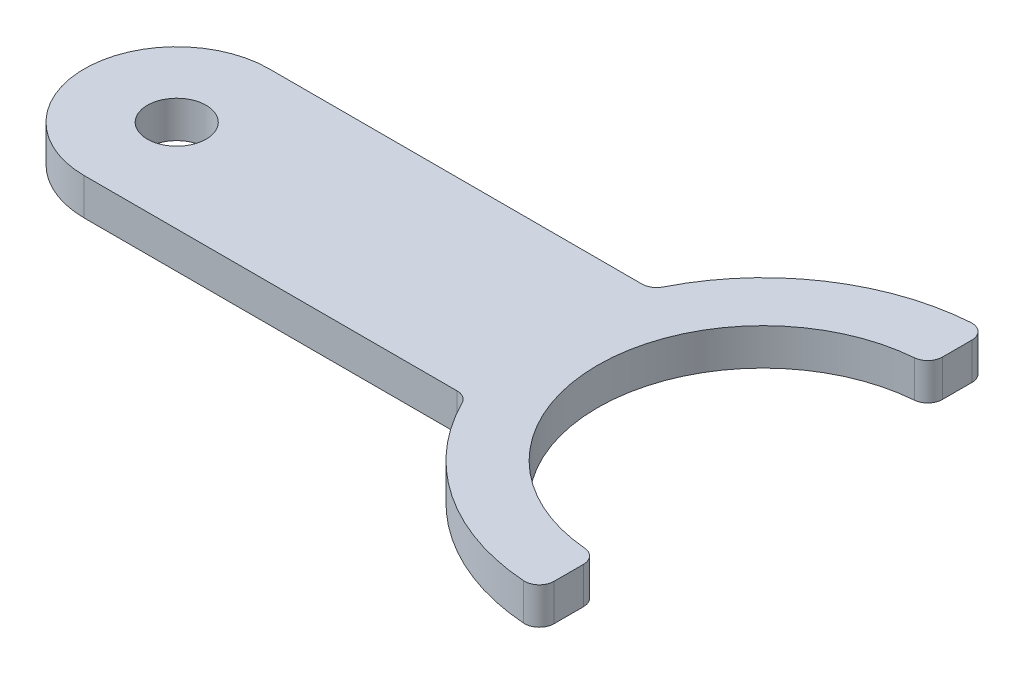
ISO-10303-21;
HEADER;
FILE_DESCRIPTION(('STEP AP214'),'2;1');
FILE_NAME('part.step','',(''),(''),'','','');
FILE_SCHEMA(('AUTOMOTIVE_DESIGN { 1 0 10303 214 1 1 1 1 }'));
ENDSEC;
DATA;
#1=APPLICATION_CONTEXT('core data for automotive mechanical design processes');
#2=APPLICATION_PROTOCOL_DEFINITION('international standard','automotive_design',2000,#1);
#3=PRODUCT_CONTEXT('',#1,'mechanical');
#4=PRODUCT('Part','Part','',(#3));
#5=PRODUCT_RELATED_PRODUCT_CATEGORY('part','',(#4));
#6=PRODUCT_DEFINITION_FORMATION('','',#4);
#7=PRODUCT_DEFINITION_CONTEXT('part definition',#1,'design');
#8=PRODUCT_DEFINITION('design','',#6,#7);
#9=PRODUCT_DEFINITION_SHAPE('','',#8);
#10=(LENGTH_UNIT() NAMED_UNIT(*) SI_UNIT(.MILLI.,.METRE.));
#11=(NAMED_UNIT(*) PLANE_ANGLE_UNIT() SI_UNIT($,.RADIAN.));
#12=(NAMED_UNIT(*) SI_UNIT($,.STERADIAN.) SOLID_ANGLE_UNIT());
#13=UNCERTAINTY_MEASURE_WITH_UNIT(LENGTH_MEASURE(1.E-05),#10,'distance_accuracy_value','');
#14=(GEOMETRIC_REPRESENTATION_CONTEXT(3) GLOBAL_UNCERTAINTY_ASSIGNED_CONTEXT((#13)) GLOBAL_UNIT_ASSIGNED_CONTEXT((#10,
#11,#12)) REPRESENTATION_CONTEXT('',''));
#15=CARTESIAN_POINT('',(0.,0.,0.));
#16=DIRECTION('',(0.,0.,1.));
#17=DIRECTION('',(1.,0.,0.));
#18=AXIS2_PLACEMENT_3D('',#15,#16,#17);
#19=CARTESIAN_POINT('',(77.756,5.,24.4182308941496));
#20=DIRECTION('',(0.,1.,0.));
#21=DIRECTION('',(0.,0.,1.));
#22=AXIS2_PLACEMENT_3D('',#19,#20,#21);
#23=PLANE('',#22);
#24=CARTESIAN_POINT('',(77.756,5.,24.4182308941496));
#25=DIRECTION('',(0.,1.,0.));
#26=DIRECTION('',(0.,0.,1.));
#27=AXIS2_PLACEMENT_3D('',#24,#25,#26);
#28=CIRCLE('',#27,2.);
#29=CARTESIAN_POINT('',(79.756,5.,24.4182308941496));
#30=VERTEX_POINT('',#29);
#31=CARTESIAN_POINT('',(77.9192653061225,5.,22.4249059231986));
#32=VERTEX_POINT('',#31);
#33=EDGE_CURVE('E222',#30,#32,#28,.T.);
#34=ORIENTED_EDGE('',*,*,#33,.T.);
#35=CARTESIAN_POINT('',(79.756,5.,0.));
#36=DIRECTION('',(0.,-1.,0.));
#37=DIRECTION('',(0.,0.,1.));
#38=AXIS2_PLACEMENT_3D('',#35,#36,#37);
#39=CIRCLE('',#38,22.5);
#40=CARTESIAN_POINT('',(77.9192653061225,5.,-22.4249059231986));
#41=VERTEX_POINT('',#40);
#42=EDGE_CURVE('E122',#32,#41,#39,.T.);
#43=ORIENTED_EDGE('',*,*,#42,.T.);
#44=CARTESIAN_POINT('',(77.756,5.,-24.4182308941496));
#45=DIRECTION('',(0.,1.,0.));
#46=DIRECTION('',(0.,0.,-1.));
#47=AXIS2_PLACEMENT_3D('',#44,#45,#46);
#48=CIRCLE('',#47,2.);
#49=CARTESIAN_POINT('',(79.756,5.,-24.4182308941496));
#50=VERTEX_POINT('',#49);
#51=EDGE_CURVE('E267',#41,#50,#48,.T.);
#52=ORIENTED_EDGE('',*,*,#51,.T.);
#53=DIRECTION('',(0.,0.,-1.));
#54=VECTOR('',#53,1.);
#55=CARTESIAN_POINT('',(79.756,5.,-28.426047400121));
#56=LINE('',#55,#54);
#57=CARTESIAN_POINT('',(79.756,5.,-28.426047400121));
#58=VERTEX_POINT('',#57);
#59=EDGE_CURVE('E287',#50,#58,#56,.T.);
#60=ORIENTED_EDGE('',*,*,#59,.T.);
#61=CARTESIAN_POINT('',(77.756,5.,-28.426047400121));
#62=DIRECTION('',(0.,1.,0.));
#63=DIRECTION('',(0.,0.,-1.));
#64=AXIS2_PLACEMENT_3D('',#61,#62,#63);
#65=CIRCLE('',#64,2.);
#66=CARTESIAN_POINT('',(77.6156309908155,5.,-30.421115454414));
#67=VERTEX_POINT('',#66);
#68=EDGE_CURVE('E283',#58,#67,#65,.T.);
#69=ORIENTED_EDGE('',*,*,#68,.T.);
#70=CARTESIAN_POINT('',(79.756,5.,0.));
#71=DIRECTION('',(0.,1.,0.));
#72=DIRECTION('',(0.,0.,1.));
#73=AXIS2_PLACEMENT_3D('',#70,#71,#72);
#74=CIRCLE('',#73,30.4963185480849);
#75=CARTESIAN_POINT('',(52.5016774511365,5.,-13.6831044499694));
#76=VERTEX_POINT('',#75);
#77=EDGE_CURVE('E286',#67,#76,#74,.T.);
#78=ORIENTED_EDGE('',*,*,#77,.T.);
#79=CARTESIAN_POINT('',(50.7142930161339,5.,-14.5804655152661));
#80=DIRECTION('',(0.,-1.,0.));
#81=DIRECTION('',(0.,0.,1.));
#82=AXIS2_PLACEMENT_3D('',#79,#80,#81);
#83=CIRCLE('',#82,2.);
#84=CARTESIAN_POINT('',(50.7142930161339,5.,-12.5804655152661));
#85=VERTEX_POINT('',#84);
#86=EDGE_CURVE('E291',#76,#85,#83,.T.);
#87=ORIENTED_EDGE('',*,*,#86,.T.);
#88=DIRECTION('',(-1.,0.,0.));
#89=VECTOR('',#88,1.);
#90=CARTESIAN_POINT('',(0.,5.,-12.5804655152661));
#91=LINE('',#90,#89);
#92=CARTESIAN_POINT('',(0.,5.,-12.5804655152661));
#93=VERTEX_POINT('',#92);
#94=EDGE_CURVE('E298',#85,#93,#91,.T.);
#95=ORIENTED_EDGE('',*,*,#94,.T.);
#96=CARTESIAN_POINT('',(0.,5.,0.));
#97=DIRECTION('',(0.,1.,0.));
#98=DIRECTION('',(0.,0.,-1.));
#99=AXIS2_PLACEMENT_3D('',#96,#97,#98);
#100=CIRCLE('',#99,12.5804655152661);
#101=CARTESIAN_POINT('',(0.,5.,12.5804655152661));
#102=VERTEX_POINT('',#101);
#103=EDGE_CURVE('E301',#93,#102,#100,.T.);
#104=ORIENTED_EDGE('',*,*,#103,.T.);
#105=DIRECTION('',(1.,0.,0.));
#106=VECTOR('',#105,1.);
#107=CARTESIAN_POINT('',(0.,5.,12.5804655152661));
#108=LINE('',#107,#106);
#109=CARTESIAN_POINT('',(50.7142930161339,5.,12.5804655152661));
#110=VERTEX_POINT('',#109);
#111=EDGE_CURVE('E304',#102,#110,#108,.T.);
#112=ORIENTED_EDGE('',*,*,#111,.T.);
#113=CARTESIAN_POINT('',(50.7142930161339,5.,14.5804655152661));
#114=DIRECTION('',(0.,-1.,0.));
#115=DIRECTION('',(0.,0.,-1.));
#116=AXIS2_PLACEMENT_3D('',#113,#114,#115);
#117=CIRCLE('',#116,2.);
#118=CARTESIAN_POINT('',(52.5016774511365,5.,13.6831044499694));
#119=VERTEX_POINT('',#118);
#120=EDGE_CURVE('E159',#110,#119,#117,.T.);
#121=ORIENTED_EDGE('',*,*,#120,.T.);
#122=CARTESIAN_POINT('',(79.756,5.,0.));
#123=DIRECTION('',(0.,1.,0.));
#124=DIRECTION('',(0.,0.,1.));
#125=AXIS2_PLACEMENT_3D('',#122,#123,#124);
#126=CIRCLE('',#125,30.4963185480849);
#127=CARTESIAN_POINT('',(77.6156309908155,5.,30.421115454414));
#128=VERTEX_POINT('',#127);
#129=EDGE_CURVE('E153',#119,#128,#126,.T.);
#130=ORIENTED_EDGE('',*,*,#129,.T.);
#131=CARTESIAN_POINT('',(77.756,5.,28.426047400121));
#132=DIRECTION('',(0.,1.,0.));
#133=DIRECTION('',(0.,0.,1.));
#134=AXIS2_PLACEMENT_3D('',#131,#132,#133);
#135=CIRCLE('',#134,2.);
#136=CARTESIAN_POINT('',(79.756,5.,28.426047400121));
#137=VERTEX_POINT('',#136);
#138=EDGE_CURVE('E157',#128,#137,#135,.T.);
#139=ORIENTED_EDGE('',*,*,#138,.T.);
#140=DIRECTION('',(0.,0.,-1.));
#141=VECTOR('',#140,1.);
#142=CARTESIAN_POINT('',(79.756,5.,28.426047400121));
#143=LINE('',#142,#141);
#144=EDGE_CURVE('E61',#137,#30,#143,.T.);
#145=ORIENTED_EDGE('',*,*,#144,.T.);
#146=EDGE_LOOP('',(#34,#43,#52,#60,#69,#78,#87,#95,#104,#112,#121,#130,#139,#145));
#147=FACE_BOUND('',#146,.T.);
#148=CARTESIAN_POINT('',(0.,5.,0.));
#149=DIRECTION('',(0.,1.,0.));
#150=DIRECTION('',(0.,0.,1.));
#151=AXIS2_PLACEMENT_3D('',#148,#149,#150);
#152=CIRCLE('',#151,4.);
#153=CARTESIAN_POINT('',(0.,5.,4.));
#154=VERTEX_POINT('',#153);
#155=EDGE_CURVE('E186',#154,#154,#152,.T.);
#156=ORIENTED_EDGE('',*,*,#155,.F.);
#157=EDGE_LOOP('',(#156));
#158=FACE_BOUND('',#157,.T.);
#159=ADVANCED_FACE('F43',(#147,#158),#23,.T.);
#160=CARTESIAN_POINT('',(77.756,0.,24.4182308941496));
#161=DIRECTION('',(0.,1.,0.));
#162=DIRECTION('',(0.,0.,1.));
#163=AXIS2_PLACEMENT_3D('',#160,#161,#162);
#164=PLANE('',#163);
#165=CARTESIAN_POINT('',(77.756,0.,24.4182308941496));
#166=DIRECTION('',(0.,1.,0.));
#167=DIRECTION('',(0.,0.,1.));
#168=AXIS2_PLACEMENT_3D('',#165,#166,#167);
#169=CIRCLE('',#168,2.);
#170=CARTESIAN_POINT('',(79.756,0.,24.4182308941496));
#171=VERTEX_POINT('',#170);
#172=CARTESIAN_POINT('',(77.9192653061225,0.,22.4249059231986));
#173=VERTEX_POINT('',#172);
#174=EDGE_CURVE('E181',#171,#173,#169,.T.);
#175=ORIENTED_EDGE('',*,*,#174,.F.);
#176=DIRECTION('',(0.,0.,-1.));
#177=VECTOR('',#176,1.);
#178=CARTESIAN_POINT('',(79.756,0.,28.426047400121));
#179=LINE('',#178,#177);
#180=CARTESIAN_POINT('',(79.756,0.,28.426047400121));
#181=VERTEX_POINT('',#180);
#182=EDGE_CURVE('E114',#181,#171,#179,.T.);
#183=ORIENTED_EDGE('',*,*,#182,.F.);
#184=CARTESIAN_POINT('',(77.756,0.,28.426047400121));
#185=DIRECTION('',(0.,1.,0.));
#186=DIRECTION('',(0.,0.,1.));
#187=AXIS2_PLACEMENT_3D('',#184,#185,#186);
#188=CIRCLE('',#187,2.);
#189=CARTESIAN_POINT('',(77.6156309908155,0.,30.421115454414));
#190=VERTEX_POINT('',#189);
#191=EDGE_CURVE('E108',#190,#181,#188,.T.);
#192=ORIENTED_EDGE('',*,*,#191,.F.);
#193=CARTESIAN_POINT('',(79.756,0.,0.));
#194=DIRECTION('',(0.,1.,0.));
#195=DIRECTION('',(0.,0.,1.));
#196=AXIS2_PLACEMENT_3D('',#193,#194,#195);
#197=CIRCLE('',#196,30.4963185480849);
#198=CARTESIAN_POINT('',(52.5016774511365,0.,13.6831044499694));
#199=VERTEX_POINT('',#198);
#200=EDGE_CURVE('E168',#199,#190,#197,.T.);
#201=ORIENTED_EDGE('',*,*,#200,.F.);
#202=CARTESIAN_POINT('',(50.7142930161339,0.,14.5804655152661));
#203=DIRECTION('',(0.,-1.,0.));
#204=DIRECTION('',(0.,0.,-1.));
#205=AXIS2_PLACEMENT_3D('',#202,#203,#204);
#206=CIRCLE('',#205,2.);
#207=CARTESIAN_POINT('',(50.7142930161339,0.,12.5804655152661));
#208=VERTEX_POINT('',#207);
#209=EDGE_CURVE('E213',#208,#199,#206,.T.);
#210=ORIENTED_EDGE('',*,*,#209,.F.);
#211=DIRECTION('',(1.,0.,0.));
#212=VECTOR('',#211,1.);
#213=CARTESIAN_POINT('',(0.,0.,12.5804655152661));
#214=LINE('',#213,#212);
#215=CARTESIAN_POINT('',(0.,0.,12.5804655152661));
#216=VERTEX_POINT('',#215);
#217=EDGE_CURVE('E210',#216,#208,#214,.T.);
#218=ORIENTED_EDGE('',*,*,#217,.F.);
#219=CARTESIAN_POINT('',(0.,0.,0.));
#220=DIRECTION('',(0.,1.,0.));
#221=DIRECTION('',(0.,0.,-1.));
#222=AXIS2_PLACEMENT_3D('',#219,#220,#221);
#223=CIRCLE('',#222,12.5804655152661);
#224=CARTESIAN_POINT('',(0.,0.,-12.5804655152661));
#225=VERTEX_POINT('',#224);
#226=EDGE_CURVE('E207',#225,#216,#223,.T.);
#227=ORIENTED_EDGE('',*,*,#226,.F.);
#228=DIRECTION('',(-1.,0.,0.));
#229=VECTOR('',#228,1.);
#230=CARTESIAN_POINT('',(0.,0.,-12.5804655152661));
#231=LINE('',#230,#229);
#232=CARTESIAN_POINT('',(50.7142930161339,0.,-12.5804655152661));
#233=VERTEX_POINT('',#232);
#234=EDGE_CURVE('E204',#233,#225,#231,.T.);
#235=ORIENTED_EDGE('',*,*,#234,.F.);
#236=CARTESIAN_POINT('',(50.7142930161339,0.,-14.5804655152661));
#237=DIRECTION('',(0.,-1.,0.));
#238=DIRECTION('',(0.,0.,1.));
#239=AXIS2_PLACEMENT_3D('',#236,#237,#238);
#240=CIRCLE('',#239,2.);
#241=CARTESIAN_POINT('',(52.5016774511365,0.,-13.6831044499694));
#242=VERTEX_POINT('',#241);
#243=EDGE_CURVE('E201',#242,#233,#240,.T.);
#244=ORIENTED_EDGE('',*,*,#243,.F.);
#245=CARTESIAN_POINT('',(79.756,0.,0.));
#246=DIRECTION('',(0.,1.,0.));
#247=DIRECTION('',(0.,0.,1.));
#248=AXIS2_PLACEMENT_3D('',#245,#246,#247);
#249=CIRCLE('',#248,30.4963185480849);
#250=CARTESIAN_POINT('',(77.6156309908155,0.,-30.421115454414));
#251=VERTEX_POINT('',#250);
#252=EDGE_CURVE('E198',#251,#242,#249,.T.);
#253=ORIENTED_EDGE('',*,*,#252,.F.);
#254=CARTESIAN_POINT('',(77.756,0.,-28.426047400121));
#255=DIRECTION('',(0.,1.,0.));
#256=DIRECTION('',(0.,0.,-1.));
#257=AXIS2_PLACEMENT_3D('',#254,#255,#256);
#258=CIRCLE('',#257,2.);
#259=CARTESIAN_POINT('',(79.756,0.,-28.426047400121));
#260=VERTEX_POINT('',#259);
#261=EDGE_CURVE('E195',#260,#251,#258,.T.);
#262=ORIENTED_EDGE('',*,*,#261,.F.);
#263=DIRECTION('',(0.,0.,-1.));
#264=VECTOR('',#263,1.);
#265=CARTESIAN_POINT('',(79.756,0.,-28.426047400121));
#266=LINE('',#265,#264);
#267=CARTESIAN_POINT('',(79.756,0.,-24.4182308941496));
#268=VERTEX_POINT('',#267);
#269=EDGE_CURVE('E192',#268,#260,#266,.T.);
#270=ORIENTED_EDGE('',*,*,#269,.F.);
#271=CARTESIAN_POINT('',(77.756,0.,-24.4182308941496));
#272=DIRECTION('',(0.,1.,0.));
#273=DIRECTION('',(0.,0.,-1.));
#274=AXIS2_PLACEMENT_3D('',#271,#272,#273);
#275=CIRCLE('',#274,2.);
#276=CARTESIAN_POINT('',(77.9192653061225,0.,-22.4249059231986));
#277=VERTEX_POINT('',#276);
#278=EDGE_CURVE('E189',#277,#268,#275,.T.);
#279=ORIENTED_EDGE('',*,*,#278,.F.);
#280=CARTESIAN_POINT('',(79.756,0.,0.));
#281=DIRECTION('',(0.,-1.,0.));
#282=DIRECTION('',(0.,0.,1.));
#283=AXIS2_PLACEMENT_3D('',#280,#281,#282);
#284=CIRCLE('',#283,22.5);
#285=EDGE_CURVE('E185',#173,#277,#284,.T.);
#286=ORIENTED_EDGE('',*,*,#285,.F.);
#287=EDGE_LOOP('',(#175,#183,#192,#201,#210,#218,#227,#235,#244,#253,#262,#270,#279,#286));
#288=FACE_BOUND('',#287,.T.);
#289=CARTESIAN_POINT('',(0.,0.,0.));
#290=DIRECTION('',(0.,1.,0.));
#291=DIRECTION('',(0.,0.,1.));
#292=AXIS2_PLACEMENT_3D('',#289,#290,#291);
#293=CIRCLE('',#292,4.);
#294=CARTESIAN_POINT('',(0.,0.,4.));
#295=VERTEX_POINT('',#294);
#296=EDGE_CURVE('E513',#295,#295,#293,.T.);
#297=ORIENTED_EDGE('',*,*,#296,.T.);
#298=EDGE_LOOP('',(#297));
#299=FACE_BOUND('',#298,.T.);
#300=ADVANCED_FACE('F271',(#288,#299),#164,.F.);
#301=CARTESIAN_POINT('',(77.756,5.,24.4182308941496));
#302=DIRECTION('',(0.,-1.,0.));
#303=DIRECTION('',(0.,0.,-1.));
#304=AXIS2_PLACEMENT_3D('',#301,#302,#303);
#305=CYLINDRICAL_SURFACE('',#304,2.);
#306=ORIENTED_EDGE('',*,*,#174,.T.);
#307=DIRECTION('',(0.,-1.,0.));
#308=VECTOR('',#307,1.);
#309=CARTESIAN_POINT('',(77.9192653061225,5.,22.4249059231986));
#310=LINE('',#309,#308);
#311=EDGE_CURVE('E11',#32,#173,#310,.T.);
#312=ORIENTED_EDGE('',*,*,#311,.F.);
#313=ORIENTED_EDGE('',*,*,#33,.F.);
#314=DIRECTION('',(0.,-1.,0.));
#315=VECTOR('',#314,1.);
#316=CARTESIAN_POINT('',(79.756,5.,24.4182308941496));
#317=LINE('',#316,#315);
#318=EDGE_CURVE('E177',#30,#171,#317,.T.);
#319=ORIENTED_EDGE('',*,*,#318,.T.);
#320=EDGE_LOOP('',(#306,#312,#313,#319));
#321=FACE_BOUND('',#320,.T.);
#322=ADVANCED_FACE('F45',(#321),#305,.T.);
#323=CARTESIAN_POINT('',(79.756,5.,0.));
#324=DIRECTION('',(0.,-1.,0.));
#325=DIRECTION('',(0.,0.,-1.));
#326=AXIS2_PLACEMENT_3D('',#323,#324,#325);
#327=CYLINDRICAL_SURFACE('',#326,22.5);
#328=ORIENTED_EDGE('',*,*,#285,.T.);
#329=DIRECTION('',(0.,-1.,0.));
#330=VECTOR('',#329,1.);
#331=CARTESIAN_POINT('',(77.9192653061225,5.,-22.4249059231986));
#332=LINE('',#331,#330);
#333=EDGE_CURVE('E53',#41,#277,#332,.T.);
#334=ORIENTED_EDGE('',*,*,#333,.F.);
#335=ORIENTED_EDGE('',*,*,#42,.F.);
#336=ORIENTED_EDGE('',*,*,#311,.T.);
#337=EDGE_LOOP('',(#328,#334,#335,#336));
#338=FACE_BOUND('',#337,.T.);
#339=ADVANCED_FACE('F340',(#338),#327,.F.);
#340=CARTESIAN_POINT('',(77.756,5.,-24.4182308941496));
#341=DIRECTION('',(0.,-1.,0.));
#342=DIRECTION('',(0.,0.,-1.));
#343=AXIS2_PLACEMENT_3D('',#340,#341,#342);
#344=CYLINDRICAL_SURFACE('',#343,2.);
#345=ORIENTED_EDGE('',*,*,#278,.T.);
#346=DIRECTION('',(0.,-1.,0.));
#347=VECTOR('',#346,1.);
#348=CARTESIAN_POINT('',(79.756,5.,-24.4182308941496));
#349=LINE('',#348,#347);
#350=EDGE_CURVE('E257',#50,#268,#349,.T.);
#351=ORIENTED_EDGE('',*,*,#350,.F.);
#352=ORIENTED_EDGE('',*,*,#51,.F.);
#353=ORIENTED_EDGE('',*,*,#333,.T.);
#354=EDGE_LOOP('',(#345,#351,#352,#353));
#355=FACE_BOUND('',#354,.T.);
#356=ADVANCED_FACE('F265',(#355),#344,.T.);
#357=CARTESIAN_POINT('',(79.756,5.,-28.426047400121));
#358=DIRECTION('',(-1.,0.,0.));
#359=DIRECTION('',(0.,0.,1.));
#360=AXIS2_PLACEMENT_3D('',#357,#358,#359);
#361=PLANE('',#360);
#362=ORIENTED_EDGE('',*,*,#269,.T.);
#363=DIRECTION('',(0.,-1.,0.));
#364=VECTOR('',#363,1.);
#365=CARTESIAN_POINT('',(79.756,5.,-28.426047400121));
#366=LINE('',#365,#364);
#367=EDGE_CURVE('E253',#58,#260,#366,.T.);
#368=ORIENTED_EDGE('',*,*,#367,.F.);
#369=ORIENTED_EDGE('',*,*,#59,.F.);
#370=ORIENTED_EDGE('',*,*,#350,.T.);
#371=EDGE_LOOP('',(#362,#368,#369,#370));
#372=FACE_BOUND('',#371,.T.);
#373=ADVANCED_FACE('F277',(#372),#361,.F.);
#374=CARTESIAN_POINT('',(77.756,5.,-28.426047400121));
#375=DIRECTION('',(0.,-1.,0.));
#376=DIRECTION('',(0.,0.,-1.));
#377=AXIS2_PLACEMENT_3D('',#374,#375,#376);
#378=CYLINDRICAL_SURFACE('',#377,2.);
#379=ORIENTED_EDGE('',*,*,#261,.T.);
#380=DIRECTION('',(0.,-1.,0.));
#381=VECTOR('',#380,1.);
#382=CARTESIAN_POINT('',(77.6156309908155,5.,-30.421115454414));
#383=LINE('',#382,#381);
#384=EDGE_CURVE('E249',#67,#251,#383,.T.);
#385=ORIENTED_EDGE('',*,*,#384,.F.);
#386=ORIENTED_EDGE('',*,*,#68,.F.);
#387=ORIENTED_EDGE('',*,*,#367,.T.);
#388=EDGE_LOOP('',(#379,#385,#386,#387));
#389=FACE_BOUND('',#388,.T.);
#390=ADVANCED_FACE('F281',(#389),#378,.T.);
#391=CARTESIAN_POINT('',(79.756,5.,0.));
#392=DIRECTION('',(0.,-1.,0.));
#393=DIRECTION('',(0.,0.,-1.));
#394=AXIS2_PLACEMENT_3D('',#391,#392,#393);
#395=CYLINDRICAL_SURFACE('',#394,30.4963185480849);
#396=ORIENTED_EDGE('',*,*,#252,.T.);
#397=DIRECTION('',(0.,-1.,0.));
#398=VECTOR('',#397,1.);
#399=CARTESIAN_POINT('',(52.5016774511365,5.,-13.6831044499694));
#400=LINE('',#399,#398);
#401=EDGE_CURVE('E245',#76,#242,#400,.T.);
#402=ORIENTED_EDGE('',*,*,#401,.F.);
#403=ORIENTED_EDGE('',*,*,#77,.F.);
#404=ORIENTED_EDGE('',*,*,#384,.T.);
#405=EDGE_LOOP('',(#396,#402,#403,#404));
#406=FACE_BOUND('',#405,.T.);
#407=ADVANCED_FACE('F353',(#406),#395,.T.);
#408=CARTESIAN_POINT('',(50.7142930161339,5.,-14.5804655152661));
#409=DIRECTION('',(0.,-1.,0.));
#410=DIRECTION('',(0.,0.,-1.));
#411=AXIS2_PLACEMENT_3D('',#408,#409,#410);
#412=CYLINDRICAL_SURFACE('',#411,2.);
#413=ORIENTED_EDGE('',*,*,#243,.T.);
#414=DIRECTION('',(0.,-1.,0.));
#415=VECTOR('',#414,1.);
#416=CARTESIAN_POINT('',(50.7142930161339,5.,-12.5804655152661));
#417=LINE('',#416,#415);
#418=EDGE_CURVE('E241',#85,#233,#417,.T.);
#419=ORIENTED_EDGE('',*,*,#418,.F.);
#420=ORIENTED_EDGE('',*,*,#86,.F.);
#421=ORIENTED_EDGE('',*,*,#401,.T.);
#422=EDGE_LOOP('',(#413,#419,#420,#421));
#423=FACE_BOUND('',#422,.T.);
#424=ADVANCED_FACE('F356',(#423),#412,.F.);
#425=CARTESIAN_POINT('',(0.,5.,-12.5804655152661));
#426=DIRECTION('',(0.,0.,1.));
#427=DIRECTION('',(1.,0.,0.));
#428=AXIS2_PLACEMENT_3D('',#425,#426,#427);
#429=PLANE('',#428);
#430=ORIENTED_EDGE('',*,*,#234,.T.);
#431=DIRECTION('',(0.,-1.,0.));
#432=VECTOR('',#431,1.);
#433=CARTESIAN_POINT('',(0.,5.,-12.5804655152661));
#434=LINE('',#433,#432);
#435=EDGE_CURVE('E237',#93,#225,#434,.T.);
#436=ORIENTED_EDGE('',*,*,#435,.F.);
#437=ORIENTED_EDGE('',*,*,#94,.F.);
#438=ORIENTED_EDGE('',*,*,#418,.T.);
#439=EDGE_LOOP('',(#430,#436,#437,#438));
#440=FACE_BOUND('',#439,.T.);
#441=ADVANCED_FACE('F360',(#440),#429,.F.);
#442=CARTESIAN_POINT('',(0.,5.,0.));
#443=DIRECTION('',(0.,-1.,0.));
#444=DIRECTION('',(0.,0.,-1.));
#445=AXIS2_PLACEMENT_3D('',#442,#443,#444);
#446=CYLINDRICAL_SURFACE('',#445,12.5804655152661);
#447=ORIENTED_EDGE('',*,*,#226,.T.);
#448=DIRECTION('',(0.,-1.,0.));
#449=VECTOR('',#448,1.);
#450=CARTESIAN_POINT('',(0.,5.,12.5804655152661));
#451=LINE('',#450,#449);
#452=EDGE_CURVE('E233',#102,#216,#451,.T.);
#453=ORIENTED_EDGE('',*,*,#452,.F.);
#454=ORIENTED_EDGE('',*,*,#103,.F.);
#455=ORIENTED_EDGE('',*,*,#435,.T.);
#456=EDGE_LOOP('',(#447,#453,#454,#455));
#457=FACE_BOUND('',#456,.T.);
#458=ADVANCED_FACE('F364',(#457),#446,.T.);
#459=CARTESIAN_POINT('',(0.,5.,12.5804655152661));
#460=DIRECTION('',(0.,0.,-1.));
#461=DIRECTION('',(-1.,0.,0.));
#462=AXIS2_PLACEMENT_3D('',#459,#460,#461);
#463=PLANE('',#462);
#464=ORIENTED_EDGE('',*,*,#217,.T.);
#465=DIRECTION('',(0.,-1.,0.));
#466=VECTOR('',#465,1.);
#467=CARTESIAN_POINT('',(50.7142930161339,5.,12.5804655152661));
#468=LINE('',#467,#466);
#469=EDGE_CURVE('E229',#110,#208,#468,.T.);
#470=ORIENTED_EDGE('',*,*,#469,.F.);
#471=ORIENTED_EDGE('',*,*,#111,.F.);
#472=ORIENTED_EDGE('',*,*,#452,.T.);
#473=EDGE_LOOP('',(#464,#470,#471,#472));
#474=FACE_BOUND('',#473,.T.);
#475=ADVANCED_FACE('F312',(#474),#463,.F.);
#476=CARTESIAN_POINT('',(50.7142930161339,5.,14.5804655152661));
#477=DIRECTION('',(0.,-1.,0.));
#478=DIRECTION('',(0.,0.,-1.));
#479=AXIS2_PLACEMENT_3D('',#476,#477,#478);
#480=CYLINDRICAL_SURFACE('',#479,2.);
#481=ORIENTED_EDGE('',*,*,#209,.T.);
#482=DIRECTION('',(0.,-1.,0.));
#483=VECTOR('',#482,1.);
#484=CARTESIAN_POINT('',(52.5016774511365,5.,13.6831044499694));
#485=LINE('',#484,#483);
#486=EDGE_CURVE('E170',#119,#199,#485,.T.);
#487=ORIENTED_EDGE('',*,*,#486,.F.);
#488=ORIENTED_EDGE('',*,*,#120,.F.);
#489=ORIENTED_EDGE('',*,*,#469,.T.);
#490=EDGE_LOOP('',(#481,#487,#488,#489));
#491=FACE_BOUND('',#490,.T.);
#492=ADVANCED_FACE('F316',(#491),#480,.F.);
#493=CARTESIAN_POINT('',(79.756,5.,0.));
#494=DIRECTION('',(0.,-1.,0.));
#495=DIRECTION('',(0.,0.,-1.));
#496=AXIS2_PLACEMENT_3D('',#493,#494,#495);
#497=CYLINDRICAL_SURFACE('',#496,30.4963185480849);
#498=ORIENTED_EDGE('',*,*,#200,.T.);
#499=DIRECTION('',(0.,-1.,0.));
#500=VECTOR('',#499,1.);
#501=CARTESIAN_POINT('',(77.6156309908155,5.,30.421115454414));
#502=LINE('',#501,#500);
#503=EDGE_CURVE('E165',#128,#190,#502,.T.);
#504=ORIENTED_EDGE('',*,*,#503,.F.);
#505=ORIENTED_EDGE('',*,*,#129,.F.);
#506=ORIENTED_EDGE('',*,*,#486,.T.);
#507=EDGE_LOOP('',(#498,#504,#505,#506));
#508=FACE_BOUND('',#507,.T.);
#509=ADVANCED_FACE('F166',(#508),#497,.T.);
#510=CARTESIAN_POINT('',(77.756,5.,28.426047400121));
#511=DIRECTION('',(0.,-1.,0.));
#512=DIRECTION('',(0.,0.,-1.));
#513=AXIS2_PLACEMENT_3D('',#510,#511,#512);
#514=CYLINDRICAL_SURFACE('',#513,2.);
#515=ORIENTED_EDGE('',*,*,#191,.T.);
#516=DIRECTION('',(0.,-1.,0.));
#517=VECTOR('',#516,1.);
#518=CARTESIAN_POINT('',(79.756,5.,28.426047400121));
#519=LINE('',#518,#517);
#520=EDGE_CURVE('E171',#137,#181,#519,.T.);
#521=ORIENTED_EDGE('',*,*,#520,.F.);
#522=ORIENTED_EDGE('',*,*,#138,.F.);
#523=ORIENTED_EDGE('',*,*,#503,.T.);
#524=EDGE_LOOP('',(#515,#521,#522,#523));
#525=FACE_BOUND('',#524,.T.);
#526=ADVANCED_FACE('F173',(#525),#514,.T.);
#527=CARTESIAN_POINT('',(79.756,5.,28.426047400121));
#528=DIRECTION('',(-1.,0.,0.));
#529=DIRECTION('',(0.,0.,1.));
#530=AXIS2_PLACEMENT_3D('',#527,#528,#529);
#531=PLANE('',#530);
#532=ORIENTED_EDGE('',*,*,#182,.T.);
#533=ORIENTED_EDGE('',*,*,#318,.F.);
#534=ORIENTED_EDGE('',*,*,#144,.F.);
#535=ORIENTED_EDGE('',*,*,#520,.T.);
#536=EDGE_LOOP('',(#532,#533,#534,#535));
#537=FACE_BOUND('',#536,.T.);
#538=ADVANCED_FACE('F320',(#537),#531,.F.);
#539=CARTESIAN_POINT('',(0.,5.,0.));
#540=DIRECTION('',(0.,-1.,0.));
#541=DIRECTION('',(0.,0.,-1.));
#542=AXIS2_PLACEMENT_3D('',#539,#540,#541);
#543=CYLINDRICAL_SURFACE('',#542,4.);
#544=ORIENTED_EDGE('',*,*,#155,.T.);
#545=EDGE_LOOP('',(#544));
#546=FACE_BOUND('',#545,.T.);
#547=ORIENTED_EDGE('',*,*,#296,.F.);
#548=EDGE_LOOP('',(#547));
#549=FACE_BOUND('',#548,.T.);
#550=ADVANCED_FACE('F322',(#546,#549),#543,.F.);
#551=CLOSED_SHELL('',(#159,#300,#322,#339,#356,#373,#390,#407,#424,#441,#458,#475,#492,#509,
#526,#538,#550));
#552=MANIFOLD_SOLID_BREP('B2',#551);
#553=ADVANCED_BREP_SHAPE_REPRESENTATION('',(#18,#552),#14);
#554=SHAPE_DEFINITION_REPRESENTATION(#9,#553);
ENDSEC;
END-ISO-10303-21;
